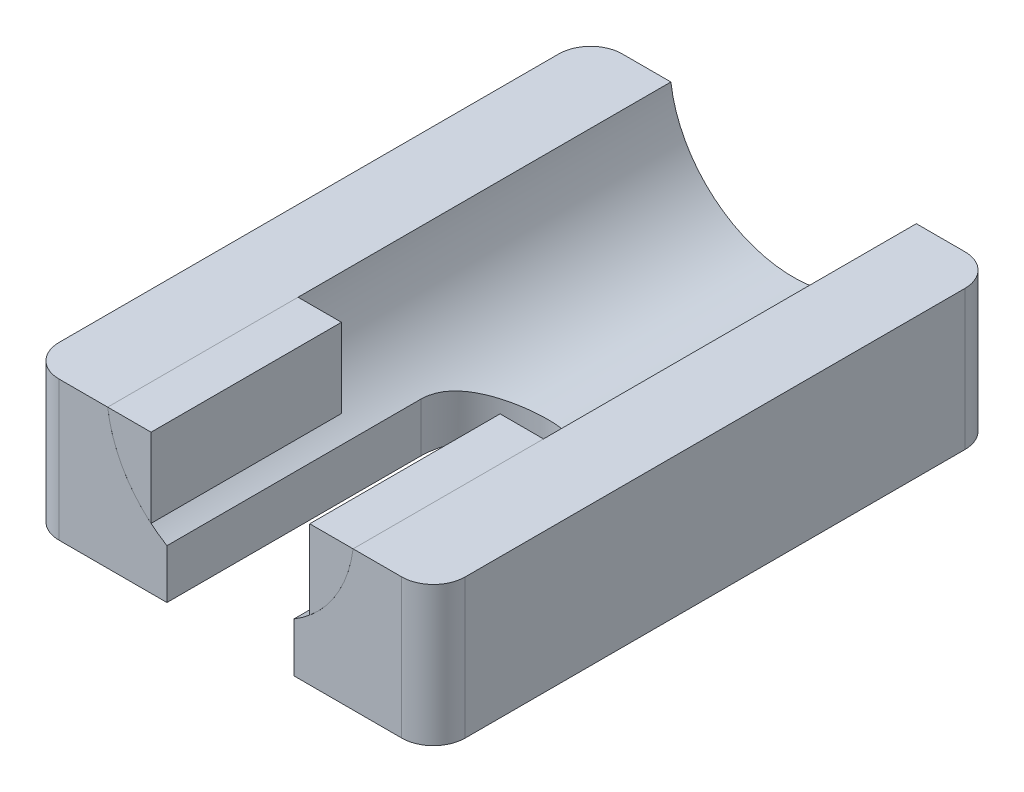
ISO-10303-21;
HEADER;
FILE_DESCRIPTION(('STEP AP214'),'2;1');
FILE_NAME('part.step','',(''),(''),'','','');
FILE_SCHEMA(('AUTOMOTIVE_DESIGN { 1 0 10303 214 1 1 1 1 }'));
ENDSEC;
DATA;
#1=APPLICATION_CONTEXT('core data for automotive mechanical design processes');
#2=APPLICATION_PROTOCOL_DEFINITION('international standard','automotive_design',2000,#1);
#3=PRODUCT_CONTEXT('',#1,'mechanical');
#4=PRODUCT('Part','Part','',(#3));
#5=PRODUCT_RELATED_PRODUCT_CATEGORY('part','',(#4));
#6=PRODUCT_DEFINITION_FORMATION('','',#4);
#7=PRODUCT_DEFINITION_CONTEXT('part definition',#1,'design');
#8=PRODUCT_DEFINITION('design','',#6,#7);
#9=PRODUCT_DEFINITION_SHAPE('','',#8);
#10=(LENGTH_UNIT() NAMED_UNIT(*) SI_UNIT(.MILLI.,.METRE.));
#11=(NAMED_UNIT(*) PLANE_ANGLE_UNIT() SI_UNIT($,.RADIAN.));
#12=(NAMED_UNIT(*) SI_UNIT($,.STERADIAN.) SOLID_ANGLE_UNIT());
#13=UNCERTAINTY_MEASURE_WITH_UNIT(LENGTH_MEASURE(1.E-05),#10,'distance_accuracy_value','');
#14=(GEOMETRIC_REPRESENTATION_CONTEXT(3) GLOBAL_UNCERTAINTY_ASSIGNED_CONTEXT((#13)) GLOBAL_UNIT_ASSIGNED_CONTEXT((#10,
#11,#12)) REPRESENTATION_CONTEXT('',''));
#15=CARTESIAN_POINT('',(0.,0.,0.));
#16=DIRECTION('',(0.,0.,1.));
#17=DIRECTION('',(1.,0.,0.));
#18=AXIS2_PLACEMENT_3D('',#15,#16,#17);
#19=CARTESIAN_POINT('',(0.,0.,11.75));
#20=DIRECTION('',(0.,0.,1.));
#21=DIRECTION('',(1.,0.,0.));
#22=AXIS2_PLACEMENT_3D('',#19,#20,#21);
#23=CYLINDRICAL_SURFACE('',#22,3.9);
#24=DIRECTION('',(0.,0.,1.));
#25=VECTOR('',#24,1.);
#26=CARTESIAN_POINT('',(-3.86781592116274,-0.5,11.75));
#27=LINE('',#26,#25);
#28=CARTESIAN_POINT('',(-3.86781592116274,-0.5,11.75));
#29=VERTEX_POINT('',#28);
#30=CARTESIAN_POINT('',(-3.86781592116274,-0.5,17.75));
#31=VERTEX_POINT('',#30);
#32=EDGE_CURVE('E84',#29,#31,#27,.T.);
#33=ORIENTED_EDGE('',*,*,#32,.F.);
#34=CARTESIAN_POINT('',(0.,0.,11.75));
#35=DIRECTION('',(0.,0.,1.));
#36=DIRECTION('',(1.,0.,0.));
#37=AXIS2_PLACEMENT_3D('',#34,#35,#36);
#38=CIRCLE('',#37,3.9);
#39=CARTESIAN_POINT('',(-2.5,-2.99332590941915,11.75));
#40=VERTEX_POINT('',#39);
#41=EDGE_CURVE('E111',#29,#40,#38,.T.);
#42=ORIENTED_EDGE('',*,*,#41,.T.);
#43=DIRECTION('',(0.,0.,1.));
#44=VECTOR('',#43,1.);
#45=CARTESIAN_POINT('',(-2.5,-2.99332590941915,11.75));
#46=LINE('',#45,#44);
#47=CARTESIAN_POINT('',(-2.5,-2.99332590941915,17.75));
#48=VERTEX_POINT('',#47);
#49=EDGE_CURVE('E112',#40,#48,#46,.T.);
#50=ORIENTED_EDGE('',*,*,#49,.T.);
#51=CARTESIAN_POINT('',(0.,0.,17.75));
#52=DIRECTION('',(0.,0.,1.));
#53=DIRECTION('',(1.,0.,0.));
#54=AXIS2_PLACEMENT_3D('',#51,#52,#53);
#55=CIRCLE('',#54,3.9);
#56=EDGE_CURVE('E101',#31,#48,#55,.T.);
#57=ORIENTED_EDGE('',*,*,#56,.F.);
#58=EDGE_LOOP('',(#33,#42,#50,#57));
#59=FACE_BOUND('',#58,.T.);
#60=ADVANCED_FACE('F55',(#59),#23,.T.);
#61=CARTESIAN_POINT('',(-2.5,2.99332590941915,11.75));
#62=DIRECTION('',(1.,0.,0.));
#63=DIRECTION('',(0.,1.,0.));
#64=AXIS2_PLACEMENT_3D('',#61,#62,#63);
#65=PLANE('',#64);
#66=DIRECTION('',(0.,0.,-1.));
#67=VECTOR('',#66,1.);
#68=CARTESIAN_POINT('',(-2.5,-0.5,11.75));
#69=LINE('',#68,#67);
#70=CARTESIAN_POINT('',(-2.5,-0.5,17.75));
#71=VERTEX_POINT('',#70);
#72=CARTESIAN_POINT('',(-2.5,-0.5,11.75));
#73=VERTEX_POINT('',#72);
#74=EDGE_CURVE('E13',#71,#73,#69,.T.);
#75=ORIENTED_EDGE('',*,*,#74,.F.);
#76=DIRECTION('',(0.,1.,0.));
#77=VECTOR('',#76,1.);
#78=CARTESIAN_POINT('',(-2.5,2.99332590941915,17.75));
#79=LINE('',#78,#77);
#80=EDGE_CURVE('E98',#48,#71,#79,.T.);
#81=ORIENTED_EDGE('',*,*,#80,.F.);
#82=ORIENTED_EDGE('',*,*,#49,.F.);
#83=DIRECTION('',(0.,1.,0.));
#84=VECTOR('',#83,1.);
#85=CARTESIAN_POINT('',(-2.5,2.99332590941915,11.75));
#86=LINE('',#85,#84);
#87=EDGE_CURVE('E58',#40,#73,#86,.T.);
#88=ORIENTED_EDGE('',*,*,#87,.T.);
#89=EDGE_LOOP('',(#75,#81,#82,#88));
#90=FACE_BOUND('',#89,.T.);
#91=ADVANCED_FACE('F96',(#90),#65,.T.);
#92=CARTESIAN_POINT('',(0.,0.,11.75));
#93=DIRECTION('',(0.,0.,1.));
#94=DIRECTION('',(1.,0.,0.));
#95=AXIS2_PLACEMENT_3D('',#92,#93,#94);
#96=PLANE('',#95);
#97=ORIENTED_EDGE('',*,*,#41,.F.);
#98=DIRECTION('',(1.,0.,0.));
#99=VECTOR('',#98,1.);
#100=CARTESIAN_POINT('',(0.,-0.5,11.75));
#101=LINE('',#100,#99);
#102=EDGE_CURVE('E72',#29,#73,#101,.T.);
#103=ORIENTED_EDGE('',*,*,#102,.T.);
#104=ORIENTED_EDGE('',*,*,#87,.F.);
#105=EDGE_LOOP('',(#97,#103,#104));
#106=FACE_BOUND('',#105,.T.);
#107=ADVANCED_FACE('F120',(#106),#96,.F.);
#108=CARTESIAN_POINT('',(0.,0.,17.75));
#109=DIRECTION('',(0.,0.,1.));
#110=DIRECTION('',(1.,0.,0.));
#111=AXIS2_PLACEMENT_3D('',#108,#109,#110);
#112=PLANE('',#111);
#113=DIRECTION('',(1.,0.,0.));
#114=VECTOR('',#113,1.);
#115=CARTESIAN_POINT('',(0.,-0.5,17.75));
#116=LINE('',#115,#114);
#117=EDGE_CURVE('E65',#31,#71,#116,.T.);
#118=ORIENTED_EDGE('',*,*,#117,.F.);
#119=ORIENTED_EDGE('',*,*,#56,.T.);
#120=ORIENTED_EDGE('',*,*,#80,.T.);
#121=EDGE_LOOP('',(#118,#119,#120));
#122=FACE_BOUND('',#121,.T.);
#123=ADVANCED_FACE('F100',(#122),#112,.T.);
#124=CARTESIAN_POINT('',(-6.4,-0.5,0.));
#125=DIRECTION('',(0.,-1.,0.));
#126=DIRECTION('',(0.,0.,-1.));
#127=AXIS2_PLACEMENT_3D('',#124,#125,#126);
#128=PLANE('',#127);
#129=ORIENTED_EDGE('',*,*,#32,.T.);
#130=ORIENTED_EDGE('',*,*,#117,.T.);
#131=ORIENTED_EDGE('',*,*,#74,.T.);
#132=ORIENTED_EDGE('',*,*,#102,.F.);
#133=EDGE_LOOP('',(#129,#130,#131,#132));
#134=FACE_BOUND('',#133,.T.);
#135=ADVANCED_FACE('F87',(#134),#128,.F.);
#136=CLOSED_SHELL('',(#60,#91,#107,#123,#135));
#137=MANIFOLD_SOLID_BREP('B2',#136);
#138=CARTESIAN_POINT('',(0.,0.,11.75));
#139=DIRECTION('',(0.,0.,1.));
#140=DIRECTION('',(1.,0.,0.));
#141=AXIS2_PLACEMENT_3D('',#138,#139,#140);
#142=CYLINDRICAL_SURFACE('',#141,3.90000000000001);
#143=DIRECTION('',(0.,0.,1.));
#144=VECTOR('',#143,1.);
#145=CARTESIAN_POINT('',(3.86781592116274,-0.5,11.75));
#146=LINE('',#145,#144);
#147=CARTESIAN_POINT('',(3.86781592116274,-0.5,17.75));
#148=VERTEX_POINT('',#147);
#149=CARTESIAN_POINT('',(3.86781592116274,-0.5,11.75));
#150=VERTEX_POINT('',#149);
#151=EDGE_CURVE('E215',#148,#150,#146,.F.);
#152=ORIENTED_EDGE('',*,*,#151,.F.);
#153=CARTESIAN_POINT('',(0.,0.,17.75));
#154=DIRECTION('',(0.,0.,1.));
#155=DIRECTION('',(-1.,0.,0.));
#156=AXIS2_PLACEMENT_3D('',#153,#154,#155);
#157=CIRCLE('',#156,3.90000000000001);
#158=CARTESIAN_POINT('',(2.5,-2.99332590941915,17.75));
#159=VERTEX_POINT('',#158);
#160=EDGE_CURVE('E188',#159,#148,#157,.T.);
#161=ORIENTED_EDGE('',*,*,#160,.F.);
#162=DIRECTION('',(0.,0.,1.));
#163=VECTOR('',#162,1.);
#164=CARTESIAN_POINT('',(2.5,-2.99332590941915,11.75));
#165=LINE('',#164,#163);
#166=CARTESIAN_POINT('',(2.5,-2.99332590941915,11.75));
#167=VERTEX_POINT('',#166);
#168=EDGE_CURVE('E235',#167,#159,#165,.T.);
#169=ORIENTED_EDGE('',*,*,#168,.F.);
#170=CARTESIAN_POINT('',(0.,0.,11.75));
#171=DIRECTION('',(0.,0.,1.));
#172=DIRECTION('',(-1.,0.,0.));
#173=AXIS2_PLACEMENT_3D('',#170,#171,#172);
#174=CIRCLE('',#173,3.90000000000001);
#175=EDGE_CURVE('E229',#167,#150,#174,.T.);
#176=ORIENTED_EDGE('',*,*,#175,.T.);
#177=EDGE_LOOP('',(#152,#161,#169,#176));
#178=FACE_BOUND('',#177,.T.);
#179=ADVANCED_FACE('F185',(#178),#142,.T.);
#180=CARTESIAN_POINT('',(2.5,2.99332590941915,11.75));
#181=DIRECTION('',(-1.,0.,0.));
#182=DIRECTION('',(0.,-1.,0.));
#183=AXIS2_PLACEMENT_3D('',#180,#181,#182);
#184=PLANE('',#183);
#185=DIRECTION('',(0.,0.,1.));
#186=VECTOR('',#185,1.);
#187=CARTESIAN_POINT('',(2.5,-0.5,11.75));
#188=LINE('',#187,#186);
#189=CARTESIAN_POINT('',(2.5,-0.5,11.75));
#190=VERTEX_POINT('',#189);
#191=CARTESIAN_POINT('',(2.5,-0.5,17.75));
#192=VERTEX_POINT('',#191);
#193=EDGE_CURVE('E53',#190,#192,#188,.T.);
#194=ORIENTED_EDGE('',*,*,#193,.F.);
#195=DIRECTION('',(0.,-1.,0.));
#196=VECTOR('',#195,1.);
#197=CARTESIAN_POINT('',(2.5,2.99332590941915,11.75));
#198=LINE('',#197,#196);
#199=EDGE_CURVE('E230',#190,#167,#198,.T.);
#200=ORIENTED_EDGE('',*,*,#199,.T.);
#201=ORIENTED_EDGE('',*,*,#168,.T.);
#202=DIRECTION('',(0.,-1.,0.));
#203=VECTOR('',#202,1.);
#204=CARTESIAN_POINT('',(2.5,2.99332590941915,17.75));
#205=LINE('',#204,#203);
#206=EDGE_CURVE('E223',#192,#159,#205,.T.);
#207=ORIENTED_EDGE('',*,*,#206,.F.);
#208=EDGE_LOOP('',(#194,#200,#201,#207));
#209=FACE_BOUND('',#208,.T.);
#210=ADVANCED_FACE('F249',(#209),#184,.T.);
#211=CARTESIAN_POINT('',(0.,0.,11.75));
#212=DIRECTION('',(0.,0.,-1.));
#213=DIRECTION('',(-1.,0.,0.));
#214=AXIS2_PLACEMENT_3D('',#211,#212,#213);
#215=PLANE('',#214);
#216=DIRECTION('',(-1.,0.,0.));
#217=VECTOR('',#216,1.);
#218=CARTESIAN_POINT('',(0.,-0.5,11.75));
#219=LINE('',#218,#217);
#220=EDGE_CURVE('E194',#150,#190,#219,.T.);
#221=ORIENTED_EDGE('',*,*,#220,.F.);
#222=ORIENTED_EDGE('',*,*,#175,.F.);
#223=ORIENTED_EDGE('',*,*,#199,.F.);
#224=EDGE_LOOP('',(#221,#222,#223));
#225=FACE_BOUND('',#224,.T.);
#226=ADVANCED_FACE('F228',(#225),#215,.T.);
#227=CARTESIAN_POINT('',(0.,0.,17.75));
#228=DIRECTION('',(0.,0.,-1.));
#229=DIRECTION('',(-1.,0.,0.));
#230=AXIS2_PLACEMENT_3D('',#227,#228,#229);
#231=PLANE('',#230);
#232=ORIENTED_EDGE('',*,*,#160,.T.);
#233=DIRECTION('',(-1.,0.,0.));
#234=VECTOR('',#233,1.);
#235=CARTESIAN_POINT('',(0.,-0.5,17.75));
#236=LINE('',#235,#234);
#237=EDGE_CURVE('E201',#148,#192,#236,.T.);
#238=ORIENTED_EDGE('',*,*,#237,.T.);
#239=ORIENTED_EDGE('',*,*,#206,.T.);
#240=EDGE_LOOP('',(#232,#238,#239));
#241=FACE_BOUND('',#240,.T.);
#242=ADVANCED_FACE('F250',(#241),#231,.F.);
#243=CARTESIAN_POINT('',(-6.4,-0.5,0.));
#244=DIRECTION('',(0.,-1.,0.));
#245=DIRECTION('',(0.,0.,-1.));
#246=AXIS2_PLACEMENT_3D('',#243,#244,#245);
#247=PLANE('',#246);
#248=ORIENTED_EDGE('',*,*,#151,.T.);
#249=ORIENTED_EDGE('',*,*,#220,.T.);
#250=ORIENTED_EDGE('',*,*,#193,.T.);
#251=ORIENTED_EDGE('',*,*,#237,.F.);
#252=EDGE_LOOP('',(#248,#249,#250,#251));
#253=FACE_BOUND('',#252,.T.);
#254=ADVANCED_FACE('F217',(#253),#247,.F.);
#255=CLOSED_SHELL('',(#179,#210,#226,#242,#254));
#256=MANIFOLD_SOLID_BREP('B7',#255);
#257=CARTESIAN_POINT('',(0.,0.,17.75));
#258=DIRECTION('',(0.,0.,1.));
#259=DIRECTION('',(1.,0.,0.));
#260=AXIS2_PLACEMENT_3D('',#257,#258,#259);
#261=PLANE('',#260);
#262=DIRECTION('',(1.,0.,0.));
#263=VECTOR('',#262,1.);
#264=CARTESIAN_POINT('',(-6.4,-0.5,17.75));
#265=LINE('',#264,#263);
#266=CARTESIAN_POINT('',(-5.4,-0.5,17.75));
#267=VERTEX_POINT('',#266);
#268=CARTESIAN_POINT('',(-3.86781592116274,-0.5,17.75));
#269=VERTEX_POINT('',#268);
#270=EDGE_CURVE('E499',#267,#269,#265,.T.);
#271=ORIENTED_EDGE('',*,*,#270,.F.);
#272=DIRECTION('',(0.,-1.,0.));
#273=VECTOR('',#272,1.);
#274=CARTESIAN_POINT('',(-5.4,-4.9,17.75));
#275=LINE('',#274,#273);
#276=CARTESIAN_POINT('',(-5.4,-4.9,17.75));
#277=VERTEX_POINT('',#276);
#278=EDGE_CURVE('E470',#267,#277,#275,.T.);
#279=ORIENTED_EDGE('',*,*,#278,.T.);
#280=DIRECTION('',(1.,0.,0.));
#281=VECTOR('',#280,1.);
#282=CARTESIAN_POINT('',(-6.4,-4.9,17.75));
#283=LINE('',#282,#281);
#284=CARTESIAN_POINT('',(-2.,-4.9,17.75));
#285=VERTEX_POINT('',#284);
#286=EDGE_CURVE('E461',#277,#285,#283,.T.);
#287=ORIENTED_EDGE('',*,*,#286,.T.);
#288=DIRECTION('',(0.,-1.,0.));
#289=VECTOR('',#288,1.);
#290=CARTESIAN_POINT('',(-2.,5.1,17.75));
#291=LINE('',#290,#289);
#292=CARTESIAN_POINT('',(-2.,-3.34813380855664,17.75));
#293=VERTEX_POINT('',#292);
#294=EDGE_CURVE('E453',#293,#285,#291,.T.);
#295=ORIENTED_EDGE('',*,*,#294,.F.);
#296=CARTESIAN_POINT('',(0.,0.,17.75));
#297=DIRECTION('',(0.,0.,1.));
#298=DIRECTION('',(1.,0.,0.));
#299=AXIS2_PLACEMENT_3D('',#296,#297,#298);
#300=CIRCLE('',#299,3.9);
#301=EDGE_CURVE('E442',#269,#293,#300,.T.);
#302=ORIENTED_EDGE('',*,*,#301,.F.);
#303=EDGE_LOOP('',(#271,#279,#287,#295,#302));
#304=FACE_BOUND('',#303,.T.);
#305=ADVANCED_FACE('F306',(#304),#261,.T.);
#306=CARTESIAN_POINT('',(3.86781592116274,-0.5,17.75));
#307=VERTEX_POINT('',#306);
#308=CARTESIAN_POINT('',(5.39999999999999,-0.5,17.75));
#309=VERTEX_POINT('',#308);
#310=EDGE_CURVE('E498',#307,#309,#265,.T.);
#311=ORIENTED_EDGE('',*,*,#310,.F.);
#312=CARTESIAN_POINT('',(2.,-3.34813380855664,17.75));
#313=VERTEX_POINT('',#312);
#314=EDGE_CURVE('E437',#313,#307,#300,.T.);
#315=ORIENTED_EDGE('',*,*,#314,.F.);
#316=DIRECTION('',(0.,-1.,0.));
#317=VECTOR('',#316,1.);
#318=CARTESIAN_POINT('',(2.,5.1,17.75));
#319=LINE('',#318,#317);
#320=CARTESIAN_POINT('',(2.,-4.9,17.75));
#321=VERTEX_POINT('',#320);
#322=EDGE_CURVE('E458',#313,#321,#319,.T.);
#323=ORIENTED_EDGE('',*,*,#322,.T.);
#324=CARTESIAN_POINT('',(5.4,-4.9,17.75));
#325=VERTEX_POINT('',#324);
#326=EDGE_CURVE('E436',#321,#325,#283,.T.);
#327=ORIENTED_EDGE('',*,*,#326,.T.);
#328=DIRECTION('',(0.,1.,0.));
#329=VECTOR('',#328,1.);
#330=CARTESIAN_POINT('',(5.4,4.9,17.75));
#331=LINE('',#330,#329);
#332=EDGE_CURVE('E431',#325,#309,#331,.T.);
#333=ORIENTED_EDGE('',*,*,#332,.T.);
#334=EDGE_LOOP('',(#311,#315,#323,#327,#333));
#335=FACE_BOUND('',#334,.T.);
#336=ADVANCED_FACE('F543',(#335),#261,.T.);
#337=CARTESIAN_POINT('',(0.,0.,0.));
#338=DIRECTION('',(0.,0.,1.));
#339=DIRECTION('',(1.,0.,0.));
#340=AXIS2_PLACEMENT_3D('',#337,#338,#339);
#341=PLANE('',#340);
#342=DIRECTION('',(0.,-1.,0.));
#343=VECTOR('',#342,1.);
#344=CARTESIAN_POINT('',(-5.4,0.,0.));
#345=LINE('',#344,#343);
#346=CARTESIAN_POINT('',(-5.4,-4.9,0.));
#347=VERTEX_POINT('',#346);
#348=CARTESIAN_POINT('',(-5.4,-0.5,0.));
#349=VERTEX_POINT('',#348);
#350=EDGE_CURVE('E435',#347,#349,#345,.F.);
#351=ORIENTED_EDGE('',*,*,#350,.T.);
#352=DIRECTION('',(1.,0.,0.));
#353=VECTOR('',#352,1.);
#354=CARTESIAN_POINT('',(-6.4,-0.5,0.));
#355=LINE('',#354,#353);
#356=CARTESIAN_POINT('',(-3.86781592116274,-0.5,0.));
#357=VERTEX_POINT('',#356);
#358=EDGE_CURVE('E447',#349,#357,#355,.T.);
#359=ORIENTED_EDGE('',*,*,#358,.T.);
#360=CARTESIAN_POINT('',(0.,0.,0.));
#361=DIRECTION('',(0.,0.,1.));
#362=DIRECTION('',(1.,0.,0.));
#363=AXIS2_PLACEMENT_3D('',#360,#361,#362);
#364=CIRCLE('',#363,3.9);
#365=CARTESIAN_POINT('',(3.86781592116274,-0.5,0.));
#366=VERTEX_POINT('',#365);
#367=EDGE_CURVE('E443',#357,#366,#364,.T.);
#368=ORIENTED_EDGE('',*,*,#367,.T.);
#369=CARTESIAN_POINT('',(5.39999999999999,-0.5,0.));
#370=VERTEX_POINT('',#369);
#371=EDGE_CURVE('E323',#366,#370,#355,.T.);
#372=ORIENTED_EDGE('',*,*,#371,.T.);
#373=DIRECTION('',(0.,1.,0.));
#374=VECTOR('',#373,1.);
#375=CARTESIAN_POINT('',(5.4,0.,0.));
#376=LINE('',#375,#374);
#377=CARTESIAN_POINT('',(5.4,-4.9,0.));
#378=VERTEX_POINT('',#377);
#379=EDGE_CURVE('E417',#370,#378,#376,.F.);
#380=ORIENTED_EDGE('',*,*,#379,.T.);
#381=DIRECTION('',(1.,0.,0.));
#382=VECTOR('',#381,1.);
#383=CARTESIAN_POINT('',(-6.4,-4.9,0.));
#384=LINE('',#383,#382);
#385=EDGE_CURVE('E479',#347,#378,#384,.T.);
#386=ORIENTED_EDGE('',*,*,#385,.F.);
#387=EDGE_LOOP('',(#351,#359,#368,#372,#380,#386));
#388=FACE_BOUND('',#387,.T.);
#389=ADVANCED_FACE('F547',(#388),#341,.F.);
#390=CARTESIAN_POINT('',(6.4,4.9,17.75));
#391=DIRECTION('',(-1.,0.,0.));
#392=DIRECTION('',(0.,-1.,0.));
#393=AXIS2_PLACEMENT_3D('',#390,#391,#392);
#394=PLANE('',#393);
#395=DIRECTION('',(0.,1.,0.));
#396=VECTOR('',#395,1.);
#397=CARTESIAN_POINT('',(6.4,4.9,1.));
#398=LINE('',#397,#396);
#399=CARTESIAN_POINT('',(6.4,-4.9,1.));
#400=VERTEX_POINT('',#399);
#401=CARTESIAN_POINT('',(6.4,-0.5,1.));
#402=VERTEX_POINT('',#401);
#403=EDGE_CURVE('E410',#400,#402,#398,.T.);
#404=ORIENTED_EDGE('',*,*,#403,.T.);
#405=DIRECTION('',(0.,0.,1.));
#406=VECTOR('',#405,1.);
#407=CARTESIAN_POINT('',(6.4,-0.5,0.));
#408=LINE('',#407,#406);
#409=CARTESIAN_POINT('',(6.4,-0.5,16.75));
#410=VERTEX_POINT('',#409);
#411=EDGE_CURVE('E401',#402,#410,#408,.T.);
#412=ORIENTED_EDGE('',*,*,#411,.T.);
#413=DIRECTION('',(0.,1.,0.));
#414=VECTOR('',#413,1.);
#415=CARTESIAN_POINT('',(6.4,-4.9,16.75));
#416=LINE('',#415,#414);
#417=CARTESIAN_POINT('',(6.4,-4.9,16.75));
#418=VERTEX_POINT('',#417);
#419=EDGE_CURVE('E409',#410,#418,#416,.F.);
#420=ORIENTED_EDGE('',*,*,#419,.T.);
#421=DIRECTION('',(0.,0.,-1.));
#422=VECTOR('',#421,1.);
#423=CARTESIAN_POINT('',(6.4,-4.9,17.75));
#424=LINE('',#423,#422);
#425=EDGE_CURVE('E421',#418,#400,#424,.T.);
#426=ORIENTED_EDGE('',*,*,#425,.T.);
#427=EDGE_LOOP('',(#404,#412,#420,#426));
#428=FACE_BOUND('',#427,.T.);
#429=ADVANCED_FACE('F419',(#428),#394,.F.);
#430=CARTESIAN_POINT('',(-6.4,4.9,17.75));
#431=DIRECTION('',(1.,0.,0.));
#432=DIRECTION('',(0.,1.,0.));
#433=AXIS2_PLACEMENT_3D('',#430,#431,#432);
#434=PLANE('',#433);
#435=DIRECTION('',(0.,-1.,0.));
#436=VECTOR('',#435,1.);
#437=CARTESIAN_POINT('',(-6.4,4.9,16.75));
#438=LINE('',#437,#436);
#439=CARTESIAN_POINT('',(-6.4,-4.9,16.75));
#440=VERTEX_POINT('',#439);
#441=CARTESIAN_POINT('',(-6.4,-0.5,16.75));
#442=VERTEX_POINT('',#441);
#443=EDGE_CURVE('E515',#440,#442,#438,.F.);
#444=ORIENTED_EDGE('',*,*,#443,.T.);
#445=DIRECTION('',(0.,0.,1.));
#446=VECTOR('',#445,1.);
#447=CARTESIAN_POINT('',(-6.4,-0.5,0.));
#448=LINE('',#447,#446);
#449=CARTESIAN_POINT('',(-6.4,-0.5,1.));
#450=VERTEX_POINT('',#449);
#451=EDGE_CURVE('E504',#450,#442,#448,.T.);
#452=ORIENTED_EDGE('',*,*,#451,.F.);
#453=DIRECTION('',(0.,-1.,0.));
#454=VECTOR('',#453,1.);
#455=CARTESIAN_POINT('',(-6.4,4.9,1.));
#456=LINE('',#455,#454);
#457=CARTESIAN_POINT('',(-6.4,-4.9,1.));
#458=VERTEX_POINT('',#457);
#459=EDGE_CURVE('E518',#450,#458,#456,.T.);
#460=ORIENTED_EDGE('',*,*,#459,.T.);
#461=DIRECTION('',(0.,0.,-1.));
#462=VECTOR('',#461,1.);
#463=CARTESIAN_POINT('',(-6.4,-4.9,17.75));
#464=LINE('',#463,#462);
#465=EDGE_CURVE('E568',#440,#458,#464,.T.);
#466=ORIENTED_EDGE('',*,*,#465,.F.);
#467=EDGE_LOOP('',(#444,#452,#460,#466));
#468=FACE_BOUND('',#467,.T.);
#469=ADVANCED_FACE('F600',(#468),#434,.F.);
#470=CARTESIAN_POINT('',(0.,0.,17.75));
#471=DIRECTION('',(0.,0.,-1.));
#472=DIRECTION('',(-1.,0.,0.));
#473=AXIS2_PLACEMENT_3D('',#470,#471,#472);
#474=CYLINDRICAL_SURFACE('',#473,3.9);
#475=DIRECTION('',(0.,0.,-1.));
#476=VECTOR('',#475,1.);
#477=CARTESIAN_POINT('',(-3.86781592116274,-0.5,17.75));
#478=LINE('',#477,#476);
#479=EDGE_CURVE('E484',#269,#357,#478,.T.);
#480=ORIENTED_EDGE('',*,*,#479,.F.);
#481=ORIENTED_EDGE('',*,*,#301,.T.);
#482=DIRECTION('',(0.,0.,-1.));
#483=VECTOR('',#482,1.);
#484=CARTESIAN_POINT('',(-2.,-3.34813380855664,17.75));
#485=LINE('',#484,#483);
#486=CARTESIAN_POINT('',(-2.,-3.34813380855664,9.75));
#487=VERTEX_POINT('',#486);
#488=EDGE_CURVE('E457',#487,#293,#485,.F.);
#489=ORIENTED_EDGE('',*,*,#488,.F.);
#490=CARTESIAN_POINT('',(2.,-3.34813380855664,9.75));
#491=CARTESIAN_POINT('',(2.00000965164554,-3.34811774602057,9.69783119988326));
#492=CARTESIAN_POINT('',(1.99795915396529,-3.34935269460603,9.64567137175789));
#493=CARTESIAN_POINT('',(1.98981390464103,-3.35420352648291,9.54181295253623));
#494=CARTESIAN_POINT('',(1.9837217897638,-3.35781785744422,9.49011408297989));
#495=CARTESIAN_POINT('',(1.9676175798649,-3.36727822001926,9.3878591836414));
#496=CARTESIAN_POINT('',(1.95762920013419,-3.3731107449337,9.33729816110965));
#497=CARTESIAN_POINT('',(1.93386719904869,-3.38678982981499,9.23736094172398));
#498=CARTESIAN_POINT('',(1.92009310953877,-3.39463663886788,9.18798489222995));
#499=CARTESIAN_POINT('',(1.87338554502133,-3.42077557765908,9.04233756802662));
#500=CARTESIAN_POINT('',(1.83501427816113,-3.44169909293925,8.9482211743586));
#501=CARTESIAN_POINT('',(1.74507503693268,-3.48816096787198,8.76769345485324));
#502=CARTESIAN_POINT('',(1.69348549244729,-3.51370685027827,8.68129503729786));
#503=CARTESIAN_POINT('',(1.57336961156299,-3.56920826734558,8.51051716414661));
#504=CARTESIAN_POINT('',(1.50376578443222,-3.59935409718508,8.42695555805277));
#505=CARTESIAN_POINT('',(1.35184962818979,-3.65912099165713,8.27206950109466));
#506=CARTESIAN_POINT('',(1.2695337301377,-3.68874190630719,8.20074849871471));
#507=CARTESIAN_POINT('',(1.08728732054599,-3.74667580872774,8.06730868143689));
#508=CARTESIAN_POINT('',(0.986515620230558,-3.77474139733619,8.00622101162893));
#509=CARTESIAN_POINT('',(0.774414901982582,-3.82388504055059,7.90224397832881));
#510=CARTESIAN_POINT('',(0.663092832759834,-3.84496765372954,7.85934273736997));
#511=CARTESIAN_POINT('',(0.441805073428483,-3.87638420803288,7.7962744322112));
#512=CARTESIAN_POINT('',(0.332351930222911,-3.8873997735462,7.77465637684653));
#513=CARTESIAN_POINT('',(0.110860357550225,-3.89999792423433,7.74997409406931));
#514=CARTESIAN_POINT('',(-0.00117640979079173,-3.90158641306117,7.74689825468259));
#515=CARTESIAN_POINT('',(-0.213681760161805,-3.89546009710339,7.75886382734569));
#516=CARTESIAN_POINT('',(-0.314272055499736,-3.88858200834706,7.77227567023244));
#517=CARTESIAN_POINT('',(-0.511538349993265,-3.86757923127461,7.81389791888032));
#518=CARTESIAN_POINT('',(-0.608214127945202,-3.8534541340555,7.84210915968018));
#519=CARTESIAN_POINT('',(-0.796540905670506,-3.81900734497093,7.91267185714717));
#520=CARTESIAN_POINT('',(-0.888108556573403,-3.79860618321079,7.95520536196688));
#521=CARTESIAN_POINT('',(-1.06302057060468,-3.75341971323059,8.05293336698537));
#522=CARTESIAN_POINT('',(-1.14636192566321,-3.72863281048192,8.1081324742047));
#523=CARTESIAN_POINT('',(-1.31117391677935,-3.67410877607054,8.23582370533326));
#524=CARTESIAN_POINT('',(-1.39166111307303,-3.6441245769165,8.30948030556673));
#525=CARTESIAN_POINT('',(-1.53969786153372,-3.58409336288882,8.46891454640996));
#526=CARTESIAN_POINT('',(-1.60723471933436,-3.55404631527236,8.55470393835306));
#527=CARTESIAN_POINT('',(-1.7320908468726,-3.49499099867138,8.74325992210977));
#528=CARTESIAN_POINT('',(-1.78836326456009,-3.46620285878997,8.84679472403954));
#529=CARTESIAN_POINT('',(-1.8821987890433,-3.41616403655142,9.06355924602346));
#530=CARTESIAN_POINT('',(-1.91980887380931,-3.39489446724929,9.17676377321782));
#531=CARTESIAN_POINT('',(-1.96454641473723,-3.36912064778522,9.36739143943234));
#532=CARTESIAN_POINT('',(-1.97777670033277,-3.36133599557284,9.44297894826505));
#533=CARTESIAN_POINT('',(-1.99552979139181,-3.35080488431118,9.59567985753793));
#534=CARTESIAN_POINT('',(-2.00003301943227,-3.34806975351079,9.67279629755831));
#535=CARTESIAN_POINT('',(-2.,-3.34813380855664,9.75));
#536=B_SPLINE_CURVE_WITH_KNOTS('',3,(#490,#491,#492,#493,#494,#495,#496,#497,#498,#499,#500,
#501,#502,#503,#504,#505,#506,#507,#508,#509,#510,#511,#512,#513,#514,#515,#516,#517,#518,#519,
#520,#521,#522,#523,#524,#525,#526,#527,#528,#529,#530,#531,#532,#533,#534,#535),.UNSPECIFIED.,
.F.,.F.,(4,2,2,2,2,2,2,2,2,2,2,2,2,2,2,2,2,2,2,2,2,2,4),(0.,0.156436824283003,0.312771688807681,
0.468169480108862,0.623586497140219,0.933437749635591,1.24379788642783,1.58094475083639,
1.91818644259142,2.27968977991096,2.64095665608833,2.97541059825939,3.30965506847056,
3.6133620114197,3.91708609252164,4.22482642484819,4.5326788734285,4.87069577053164,
5.2090423283336,5.57108501574338,5.9322116642596,6.16297328914682,6.39425198546379),.UNSPECIFIED.);
#537=CARTESIAN_POINT('',(2.,-3.34813380855664,9.75));
#538=VERTEX_POINT('',#537);
#539=EDGE_CURVE('E452',#538,#487,#536,.T.);
#540=ORIENTED_EDGE('',*,*,#539,.F.);
#541=DIRECTION('',(0.,0.,-1.));
#542=VECTOR('',#541,1.);
#543=CARTESIAN_POINT('',(2.,-3.34813380855664,17.75));
#544=LINE('',#543,#542);
#545=EDGE_CURVE('E491',#313,#538,#544,.T.);
#546=ORIENTED_EDGE('',*,*,#545,.F.);
#547=ORIENTED_EDGE('',*,*,#314,.T.);
#548=DIRECTION('',(0.,0.,-1.));
#549=VECTOR('',#548,1.);
#550=CARTESIAN_POINT('',(3.86781592116274,-0.5,17.75));
#551=LINE('',#550,#549);
#552=EDGE_CURVE('E495',#366,#307,#551,.F.);
#553=ORIENTED_EDGE('',*,*,#552,.F.);
#554=ORIENTED_EDGE('',*,*,#367,.F.);
#555=EDGE_LOOP('',(#480,#481,#489,#540,#546,#547,#553,#554));
#556=FACE_BOUND('',#555,.T.);
#557=ADVANCED_FACE('F531',(#556),#474,.F.);
#558=CARTESIAN_POINT('',(5.4,0.,16.75));
#559=DIRECTION('',(0.,-1.,0.));
#560=DIRECTION('',(1.,0.,0.));
#561=AXIS2_PLACEMENT_3D('',#558,#559,#560);
#562=CYLINDRICAL_SURFACE('',#561,1.);
#563=CARTESIAN_POINT('',(5.4,-0.5,16.75));
#564=DIRECTION('',(0.,-1.,0.));
#565=DIRECTION('',(0.,0.,-1.));
#566=AXIS2_PLACEMENT_3D('',#563,#564,#565);
#567=CIRCLE('',#566,1.);
#568=EDGE_CURVE('E316',#309,#410,#567,.F.);
#569=ORIENTED_EDGE('',*,*,#568,.F.);
#570=ORIENTED_EDGE('',*,*,#332,.F.);
#571=CARTESIAN_POINT('',(5.4,-4.9,16.75));
#572=DIRECTION('',(0.,1.,0.));
#573=DIRECTION('',(0.,0.,1.));
#574=AXIS2_PLACEMENT_3D('',#571,#572,#573);
#575=CIRCLE('',#574,1.);
#576=EDGE_CURVE('E441',#418,#325,#575,.F.);
#577=ORIENTED_EDGE('',*,*,#576,.F.);
#578=ORIENTED_EDGE('',*,*,#419,.F.);
#579=EDGE_LOOP('',(#569,#570,#577,#578));
#580=FACE_BOUND('',#579,.T.);
#581=ADVANCED_FACE('F581',(#580),#562,.T.);
#582=CARTESIAN_POINT('',(-5.4,0.,16.75));
#583=DIRECTION('',(0.,1.,0.));
#584=DIRECTION('',(-1.,0.,0.));
#585=AXIS2_PLACEMENT_3D('',#582,#583,#584);
#586=CYLINDRICAL_SURFACE('',#585,1.);
#587=CARTESIAN_POINT('',(-5.4,-0.5,16.75));
#588=DIRECTION('',(0.,-1.,0.));
#589=DIRECTION('',(0.,0.,-1.));
#590=AXIS2_PLACEMENT_3D('',#587,#588,#589);
#591=CIRCLE('',#590,1.);
#592=EDGE_CURVE('E502',#442,#267,#591,.F.);
#593=ORIENTED_EDGE('',*,*,#592,.F.);
#594=ORIENTED_EDGE('',*,*,#443,.F.);
#595=CARTESIAN_POINT('',(-5.4,-4.9,16.75));
#596=DIRECTION('',(0.,1.,0.));
#597=DIRECTION('',(0.,0.,1.));
#598=AXIS2_PLACEMENT_3D('',#595,#596,#597);
#599=CIRCLE('',#598,1.);
#600=EDGE_CURVE('E572',#277,#440,#599,.F.);
#601=ORIENTED_EDGE('',*,*,#600,.F.);
#602=ORIENTED_EDGE('',*,*,#278,.F.);
#603=EDGE_LOOP('',(#593,#594,#601,#602));
#604=FACE_BOUND('',#603,.T.);
#605=ADVANCED_FACE('F604',(#604),#586,.T.);
#606=CARTESIAN_POINT('',(5.4,4.9,1.));
#607=DIRECTION('',(0.,1.,0.));
#608=DIRECTION('',(-1.,0.,0.));
#609=AXIS2_PLACEMENT_3D('',#606,#607,#608);
#610=CYLINDRICAL_SURFACE('',#609,1.);
#611=CARTESIAN_POINT('',(5.4,-0.5,1.));
#612=DIRECTION('',(0.,-1.,0.));
#613=DIRECTION('',(0.,0.,-1.));
#614=AXIS2_PLACEMENT_3D('',#611,#612,#613);
#615=CIRCLE('',#614,1.);
#616=EDGE_CURVE('E183',#402,#370,#615,.F.);
#617=ORIENTED_EDGE('',*,*,#616,.F.);
#618=ORIENTED_EDGE('',*,*,#403,.F.);
#619=CARTESIAN_POINT('',(5.4,-4.9,1.));
#620=DIRECTION('',(0.,1.,0.));
#621=DIRECTION('',(0.,0.,1.));
#622=AXIS2_PLACEMENT_3D('',#619,#620,#621);
#623=CIRCLE('',#622,1.);
#624=EDGE_CURVE('E580',#378,#400,#623,.F.);
#625=ORIENTED_EDGE('',*,*,#624,.F.);
#626=ORIENTED_EDGE('',*,*,#379,.F.);
#627=EDGE_LOOP('',(#617,#618,#625,#626));
#628=FACE_BOUND('',#627,.T.);
#629=ADVANCED_FACE('F415',(#628),#610,.T.);
#630=CARTESIAN_POINT('',(-5.4,4.9,1.));
#631=DIRECTION('',(0.,-1.,0.));
#632=DIRECTION('',(1.,0.,0.));
#633=AXIS2_PLACEMENT_3D('',#630,#631,#632);
#634=CYLINDRICAL_SURFACE('',#633,1.);
#635=CARTESIAN_POINT('',(-5.4,-0.5,1.));
#636=DIRECTION('',(0.,-1.,0.));
#637=DIRECTION('',(0.,0.,-1.));
#638=AXIS2_PLACEMENT_3D('',#635,#636,#637);
#639=CIRCLE('',#638,1.);
#640=EDGE_CURVE('E494',#349,#450,#639,.F.);
#641=ORIENTED_EDGE('',*,*,#640,.F.);
#642=ORIENTED_EDGE('',*,*,#350,.F.);
#643=CARTESIAN_POINT('',(-5.4,-4.9,1.));
#644=DIRECTION('',(0.,1.,0.));
#645=DIRECTION('',(0.,0.,1.));
#646=AXIS2_PLACEMENT_3D('',#643,#644,#645);
#647=CIRCLE('',#646,1.);
#648=EDGE_CURVE('E571',#458,#347,#647,.F.);
#649=ORIENTED_EDGE('',*,*,#648,.F.);
#650=ORIENTED_EDGE('',*,*,#459,.F.);
#651=EDGE_LOOP('',(#641,#642,#649,#650));
#652=FACE_BOUND('',#651,.T.);
#653=ADVANCED_FACE('F596',(#652),#634,.T.);
#654=CARTESIAN_POINT('',(-6.4,-4.9,17.75));
#655=DIRECTION('',(0.,1.,0.));
#656=DIRECTION('',(0.,0.,1.));
#657=AXIS2_PLACEMENT_3D('',#654,#655,#656);
#658=PLANE('',#657);
#659=ORIENTED_EDGE('',*,*,#425,.F.);
#660=ORIENTED_EDGE('',*,*,#576,.T.);
#661=ORIENTED_EDGE('',*,*,#326,.F.);
#662=DIRECTION('',(0.,0.,1.));
#663=VECTOR('',#662,1.);
#664=CARTESIAN_POINT('',(2.,-4.9,9.75));
#665=LINE('',#664,#663);
#666=CARTESIAN_POINT('',(2.,-4.9,9.75));
#667=VERTEX_POINT('',#666);
#668=EDGE_CURVE('E485',#667,#321,#665,.T.);
#669=ORIENTED_EDGE('',*,*,#668,.F.);
#670=CARTESIAN_POINT('',(0.,-4.9,9.75));
#671=DIRECTION('',(0.,-1.,0.));
#672=DIRECTION('',(0.,0.,-1.));
#673=AXIS2_PLACEMENT_3D('',#670,#671,#672);
#674=CIRCLE('',#673,2.);
#675=CARTESIAN_POINT('',(-2.,-4.9,9.75));
#676=VERTEX_POINT('',#675);
#677=EDGE_CURVE('E451',#676,#667,#674,.T.);
#678=ORIENTED_EDGE('',*,*,#677,.F.);
#679=DIRECTION('',(0.,0.,-1.));
#680=VECTOR('',#679,1.);
#681=CARTESIAN_POINT('',(-2.,-4.9,9.75));
#682=LINE('',#681,#680);
#683=EDGE_CURVE('E456',#285,#676,#682,.T.);
#684=ORIENTED_EDGE('',*,*,#683,.F.);
#685=ORIENTED_EDGE('',*,*,#286,.F.);
#686=ORIENTED_EDGE('',*,*,#600,.T.);
#687=ORIENTED_EDGE('',*,*,#465,.T.);
#688=ORIENTED_EDGE('',*,*,#648,.T.);
#689=ORIENTED_EDGE('',*,*,#385,.T.);
#690=ORIENTED_EDGE('',*,*,#624,.T.);
#691=EDGE_LOOP('',(#659,#660,#661,#669,#678,#684,#685,#686,#687,#688,#689,#690));
#692=FACE_BOUND('',#691,.T.);
#693=ADVANCED_FACE('F578',(#692),#658,.F.);
#694=CARTESIAN_POINT('',(0.,5.1,9.75));
#695=DIRECTION('',(0.,-1.,0.));
#696=DIRECTION('',(0.,0.,-1.));
#697=AXIS2_PLACEMENT_3D('',#694,#695,#696);
#698=CYLINDRICAL_SURFACE('',#697,2.);
#699=ORIENTED_EDGE('',*,*,#539,.T.);
#700=DIRECTION('',(0.,-1.,0.));
#701=VECTOR('',#700,1.);
#702=CARTESIAN_POINT('',(-2.,5.1,9.75));
#703=LINE('',#702,#701);
#704=EDGE_CURVE('E448',#487,#676,#703,.T.);
#705=ORIENTED_EDGE('',*,*,#704,.T.);
#706=ORIENTED_EDGE('',*,*,#677,.T.);
#707=DIRECTION('',(0.,-1.,0.));
#708=VECTOR('',#707,1.);
#709=CARTESIAN_POINT('',(2.,5.1,9.75));
#710=LINE('',#709,#708);
#711=EDGE_CURVE('E309',#538,#667,#710,.T.);
#712=ORIENTED_EDGE('',*,*,#711,.F.);
#713=EDGE_LOOP('',(#699,#705,#706,#712));
#714=FACE_BOUND('',#713,.T.);
#715=ADVANCED_FACE('F610',(#714),#698,.F.);
#716=CARTESIAN_POINT('',(2.,5.1,9.75));
#717=DIRECTION('',(1.,0.,0.));
#718=DIRECTION('',(0.,0.,-1.));
#719=AXIS2_PLACEMENT_3D('',#716,#717,#718);
#720=PLANE('',#719);
#721=ORIENTED_EDGE('',*,*,#545,.T.);
#722=ORIENTED_EDGE('',*,*,#711,.T.);
#723=ORIENTED_EDGE('',*,*,#668,.T.);
#724=ORIENTED_EDGE('',*,*,#322,.F.);
#725=EDGE_LOOP('',(#721,#722,#723,#724));
#726=FACE_BOUND('',#725,.T.);
#727=ADVANCED_FACE('F611',(#726),#720,.F.);
#728=CARTESIAN_POINT('',(-2.,5.1,9.75));
#729=DIRECTION('',(-1.,0.,0.));
#730=DIRECTION('',(0.,0.,1.));
#731=AXIS2_PLACEMENT_3D('',#728,#729,#730);
#732=PLANE('',#731);
#733=ORIENTED_EDGE('',*,*,#488,.T.);
#734=ORIENTED_EDGE('',*,*,#294,.T.);
#735=ORIENTED_EDGE('',*,*,#683,.T.);
#736=ORIENTED_EDGE('',*,*,#704,.F.);
#737=EDGE_LOOP('',(#733,#734,#735,#736));
#738=FACE_BOUND('',#737,.T.);
#739=ADVANCED_FACE('F537',(#738),#732,.F.);
#740=CARTESIAN_POINT('',(-6.4,-0.5,0.));
#741=DIRECTION('',(0.,-1.,0.));
#742=DIRECTION('',(0.,0.,-1.));
#743=AXIS2_PLACEMENT_3D('',#740,#741,#742);
#744=PLANE('',#743);
#745=ORIENTED_EDGE('',*,*,#479,.T.);
#746=ORIENTED_EDGE('',*,*,#358,.F.);
#747=ORIENTED_EDGE('',*,*,#640,.T.);
#748=ORIENTED_EDGE('',*,*,#451,.T.);
#749=ORIENTED_EDGE('',*,*,#592,.T.);
#750=ORIENTED_EDGE('',*,*,#270,.T.);
#751=EDGE_LOOP('',(#745,#746,#747,#748,#749,#750));
#752=FACE_BOUND('',#751,.T.);
#753=ADVANCED_FACE('F598',(#752),#744,.F.);
#754=ORIENTED_EDGE('',*,*,#552,.T.);
#755=ORIENTED_EDGE('',*,*,#310,.T.);
#756=ORIENTED_EDGE('',*,*,#568,.T.);
#757=ORIENTED_EDGE('',*,*,#411,.F.);
#758=ORIENTED_EDGE('',*,*,#616,.T.);
#759=ORIENTED_EDGE('',*,*,#371,.F.);
#760=EDGE_LOOP('',(#754,#755,#756,#757,#758,#759));
#761=FACE_BOUND('',#760,.T.);
#762=ADVANCED_FACE('F403',(#761),#744,.F.);
#763=CLOSED_SHELL('',(#305,#336,#389,#429,#469,#557,#581,#605,#629,#653,#693,#715,#727,#739,
#753,#762));
#764=MANIFOLD_SOLID_BREP('B47',#763);
#765=ADVANCED_BREP_SHAPE_REPRESENTATION('',(#18,#137,#256,#764),#14);
#766=SHAPE_DEFINITION_REPRESENTATION(#9,#765);
ENDSEC;
END-ISO-10303-21;
